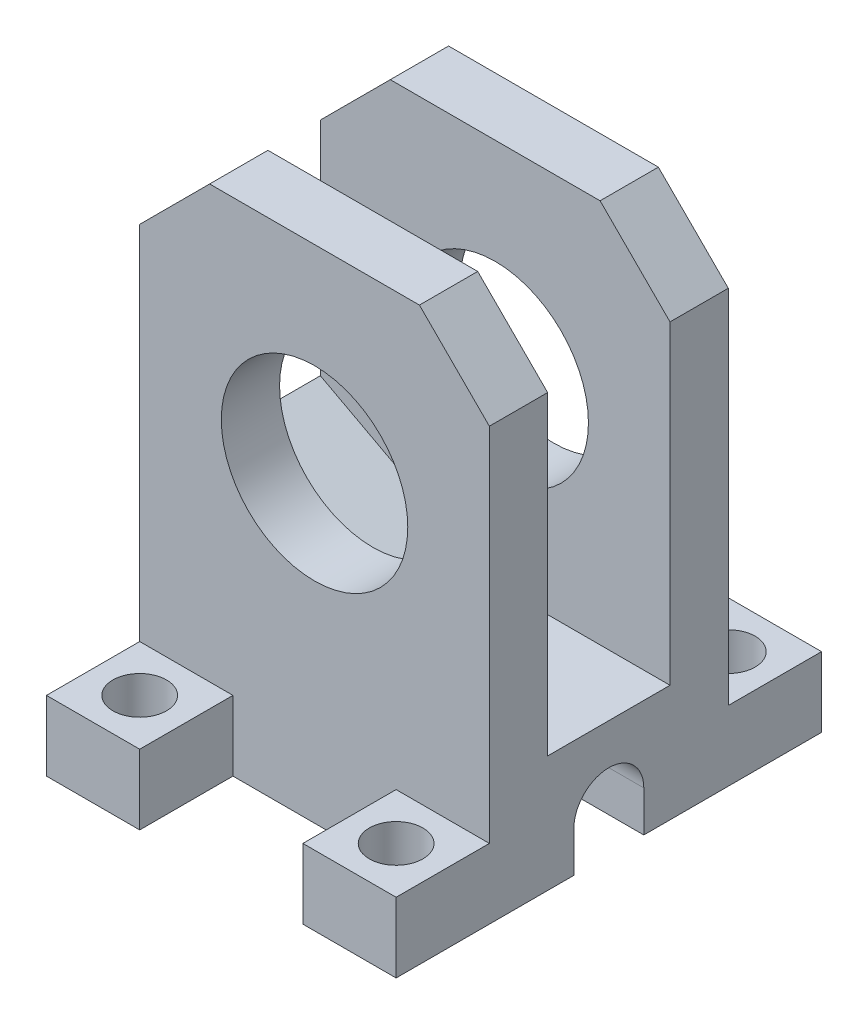
ISO-10303-21;
HEADER;
FILE_DESCRIPTION(('STEP AP214'),'2;1');
FILE_NAME('part.step','',(''),(''),'','','');
FILE_SCHEMA(('AUTOMOTIVE_DESIGN { 1 0 10303 214 1 1 1 1 }'));
ENDSEC;
DATA;
#1=APPLICATION_CONTEXT('core data for automotive mechanical design processes');
#2=APPLICATION_PROTOCOL_DEFINITION('international standard','automotive_design',2000,#1);
#3=PRODUCT_CONTEXT('',#1,'mechanical');
#4=PRODUCT('Part','Part','',(#3));
#5=PRODUCT_RELATED_PRODUCT_CATEGORY('part','',(#4));
#6=PRODUCT_DEFINITION_FORMATION('','',#4);
#7=PRODUCT_DEFINITION_CONTEXT('part definition',#1,'design');
#8=PRODUCT_DEFINITION('design','',#6,#7);
#9=PRODUCT_DEFINITION_SHAPE('','',#8);
#10=(LENGTH_UNIT() NAMED_UNIT(*) SI_UNIT(.MILLI.,.METRE.));
#11=(NAMED_UNIT(*) PLANE_ANGLE_UNIT() SI_UNIT($,.RADIAN.));
#12=(NAMED_UNIT(*) SI_UNIT($,.STERADIAN.) SOLID_ANGLE_UNIT());
#13=UNCERTAINTY_MEASURE_WITH_UNIT(LENGTH_MEASURE(1.E-05),#10,'distance_accuracy_value','');
#14=(GEOMETRIC_REPRESENTATION_CONTEXT(3) GLOBAL_UNCERTAINTY_ASSIGNED_CONTEXT((#13)) GLOBAL_UNIT_ASSIGNED_CONTEXT((#10,
#11,#12)) REPRESENTATION_CONTEXT('',''));
#15=CARTESIAN_POINT('',(0.,0.,0.));
#16=DIRECTION('',(0.,0.,1.));
#17=DIRECTION('',(1.,0.,0.));
#18=AXIS2_PLACEMENT_3D('',#15,#16,#17);
#19=CARTESIAN_POINT('',(0.,0.,-5.));
#20=DIRECTION('',(0.,0.,-1.));
#21=DIRECTION('',(-1.,0.,0.));
#22=AXIS2_PLACEMENT_3D('',#19,#20,#21);
#23=PLANE('',#22);
#24=CARTESIAN_POINT('',(0.,28.,-5.));
#25=DIRECTION('',(0.,0.,1.));
#26=DIRECTION('',(1.,0.,0.));
#27=AXIS2_PLACEMENT_3D('',#24,#25,#26);
#28=CIRCLE('',#27,8.);
#29=CARTESIAN_POINT('',(8.,28.,-5.));
#30=VERTEX_POINT('',#29);
#31=EDGE_CURVE('E260',#30,#30,#28,.T.);
#32=ORIENTED_EDGE('',*,*,#31,.T.);
#33=EDGE_LOOP('',(#32));
#34=FACE_BOUND('',#33,.T.);
#35=DIRECTION('',(1.,0.,0.));
#36=VECTOR('',#35,1.);
#37=CARTESIAN_POINT('',(-15.,12.,-5.));
#38=LINE('',#37,#36);
#39=CARTESIAN_POINT('',(0.,12.,-5.));
#40=VERTEX_POINT('',#39);
#41=CARTESIAN_POINT('',(15.,12.,-5.));
#42=VERTEX_POINT('',#41);
#43=EDGE_CURVE('E304',#40,#42,#38,.T.);
#44=ORIENTED_EDGE('',*,*,#43,.F.);
#45=DIRECTION('',(0.882352941176471,-0.470588235294118,0.));
#46=VECTOR('',#45,1.);
#47=CARTESIAN_POINT('',(-15.,20.,-5.));
#48=LINE('',#47,#46);
#49=CARTESIAN_POINT('',(-15.,20.,-5.));
#50=VERTEX_POINT('',#49);
#51=EDGE_CURVE('E52',#50,#40,#48,.T.);
#52=ORIENTED_EDGE('',*,*,#51,.F.);
#53=DIRECTION('',(0.,-1.,0.));
#54=VECTOR('',#53,1.);
#55=CARTESIAN_POINT('',(-15.,0.,-5.));
#56=LINE('',#55,#54);
#57=CARTESIAN_POINT('',(-15.,39.,-5.));
#58=VERTEX_POINT('',#57);
#59=EDGE_CURVE('E272',#58,#50,#56,.T.);
#60=ORIENTED_EDGE('',*,*,#59,.F.);
#61=DIRECTION('',(0.707106781186548,0.707106781186547,0.));
#62=VECTOR('',#61,1.);
#63=CARTESIAN_POINT('',(-27.,27.,-5.));
#64=LINE('',#63,#62);
#65=CARTESIAN_POINT('',(-9.,45.,-5.));
#66=VERTEX_POINT('',#65);
#67=EDGE_CURVE('E355',#58,#66,#64,.T.);
#68=ORIENTED_EDGE('',*,*,#67,.T.);
#69=DIRECTION('',(-1.,0.,0.));
#70=VECTOR('',#69,1.);
#71=CARTESIAN_POINT('',(-15.,45.,-5.));
#72=LINE('',#71,#70);
#73=CARTESIAN_POINT('',(8.99999999999999,45.,-5.));
#74=VERTEX_POINT('',#73);
#75=EDGE_CURVE('E249',#74,#66,#72,.T.);
#76=ORIENTED_EDGE('',*,*,#75,.F.);
#77=DIRECTION('',(0.707106781186548,-0.707106781186547,0.));
#78=VECTOR('',#77,1.);
#79=CARTESIAN_POINT('',(27.,27.,-5.));
#80=LINE('',#79,#78);
#81=CARTESIAN_POINT('',(15.,39.,-5.));
#82=VERTEX_POINT('',#81);
#83=EDGE_CURVE('E349',#74,#82,#80,.T.);
#84=ORIENTED_EDGE('',*,*,#83,.T.);
#85=DIRECTION('',(0.,1.,0.));
#86=VECTOR('',#85,1.);
#87=CARTESIAN_POINT('',(15.,45.,-5.));
#88=LINE('',#87,#86);
#89=EDGE_CURVE('E258',#42,#82,#88,.T.);
#90=ORIENTED_EDGE('',*,*,#89,.F.);
#91=EDGE_LOOP('',(#44,#52,#60,#68,#76,#84,#90));
#92=FACE_BOUND('',#91,.T.);
#93=ADVANCED_FACE('F37',(#34,#92),#23,.T.);
#94=CARTESIAN_POINT('',(-15.,45.,-15.5));
#95=DIRECTION('',(0.,0.,1.));
#96=DIRECTION('',(1.,0.,0.));
#97=AXIS2_PLACEMENT_3D('',#94,#95,#96);
#98=PLANE('',#97);
#99=CARTESIAN_POINT('',(0.,28.,-15.5));
#100=DIRECTION('',(0.,0.,1.));
#101=DIRECTION('',(1.,0.,0.));
#102=AXIS2_PLACEMENT_3D('',#99,#100,#101);
#103=CIRCLE('',#102,8.);
#104=CARTESIAN_POINT('',(8.,28.,-15.5));
#105=VERTEX_POINT('',#104);
#106=EDGE_CURVE('E294',#105,#105,#103,.T.);
#107=ORIENTED_EDGE('',*,*,#106,.F.);
#108=EDGE_LOOP('',(#107));
#109=FACE_BOUND('',#108,.T.);
#110=DIRECTION('',(0.,-1.,0.));
#111=VECTOR('',#110,1.);
#112=CARTESIAN_POINT('',(-15.,45.,-15.5));
#113=LINE('',#112,#111);
#114=CARTESIAN_POINT('',(-15.,39.,-15.5));
#115=VERTEX_POINT('',#114);
#116=CARTESIAN_POINT('',(-15.,20.,-15.5));
#117=VERTEX_POINT('',#116);
#118=EDGE_CURVE('E60',#115,#117,#113,.T.);
#119=ORIENTED_EDGE('',*,*,#118,.T.);
#120=DIRECTION('',(0.882352941176471,-0.470588235294118,0.));
#121=VECTOR('',#120,1.);
#122=CARTESIAN_POINT('',(-15.,20.,-15.5));
#123=LINE('',#122,#121);
#124=CARTESIAN_POINT('',(0.,12.,-15.5));
#125=VERTEX_POINT('',#124);
#126=EDGE_CURVE('E332',#117,#125,#123,.T.);
#127=ORIENTED_EDGE('',*,*,#126,.T.);
#128=DIRECTION('',(1.,0.,0.));
#129=VECTOR('',#128,1.);
#130=CARTESIAN_POINT('',(-15.,12.,-15.5));
#131=LINE('',#130,#129);
#132=CARTESIAN_POINT('',(15.,12.,-15.5));
#133=VERTEX_POINT('',#132);
#134=EDGE_CURVE('E311',#125,#133,#131,.T.);
#135=ORIENTED_EDGE('',*,*,#134,.T.);
#136=DIRECTION('',(0.,-1.,0.));
#137=VECTOR('',#136,1.);
#138=CARTESIAN_POINT('',(15.,45.,-15.5));
#139=LINE('',#138,#137);
#140=CARTESIAN_POINT('',(15.,39.,-15.5));
#141=VERTEX_POINT('',#140);
#142=EDGE_CURVE('E305',#141,#133,#139,.T.);
#143=ORIENTED_EDGE('',*,*,#142,.F.);
#144=DIRECTION('',(-0.707106781186548,0.707106781186547,0.));
#145=VECTOR('',#144,1.);
#146=CARTESIAN_POINT('',(-3.00000000000001,57.,-15.5));
#147=LINE('',#146,#145);
#148=CARTESIAN_POINT('',(8.99999999999999,45.,-15.5));
#149=VERTEX_POINT('',#148);
#150=EDGE_CURVE('E347',#141,#149,#147,.T.);
#151=ORIENTED_EDGE('',*,*,#150,.T.);
#152=DIRECTION('',(-1.,0.,0.));
#153=VECTOR('',#152,1.);
#154=CARTESIAN_POINT('',(-15.,45.,-15.5));
#155=LINE('',#154,#153);
#156=CARTESIAN_POINT('',(-9.00000000000001,45.,-15.5));
#157=VERTEX_POINT('',#156);
#158=EDGE_CURVE('E283',#149,#157,#155,.T.);
#159=ORIENTED_EDGE('',*,*,#158,.T.);
#160=DIRECTION('',(-0.707106781186548,-0.707106781186547,0.));
#161=VECTOR('',#160,1.);
#162=CARTESIAN_POINT('',(-12.,42.,-15.5));
#163=LINE('',#162,#161);
#164=EDGE_CURVE('E353',#157,#115,#163,.T.);
#165=ORIENTED_EDGE('',*,*,#164,.T.);
#166=EDGE_LOOP('',(#119,#127,#135,#143,#151,#159,#165));
#167=FACE_BOUND('',#166,.T.);
#168=ADVANCED_FACE('F519',(#109,#167),#98,.T.);
#169=CARTESIAN_POINT('',(-15.,12.,-15.5));
#170=DIRECTION('',(0.,-1.,0.));
#171=DIRECTION('',(1.,0.,0.));
#172=AXIS2_PLACEMENT_3D('',#169,#170,#171);
#173=PLANE('',#172);
#174=DIRECTION('',(0.,0.,1.));
#175=VECTOR('',#174,1.);
#176=CARTESIAN_POINT('',(0.,12.,-15.5));
#177=LINE('',#176,#175);
#178=EDGE_CURVE('E333',#125,#40,#177,.T.);
#179=ORIENTED_EDGE('',*,*,#178,.T.);
#180=ORIENTED_EDGE('',*,*,#43,.T.);
#181=DIRECTION('',(0.,0.,1.));
#182=VECTOR('',#181,1.);
#183=CARTESIAN_POINT('',(15.,12.,-15.5));
#184=LINE('',#183,#182);
#185=EDGE_CURVE('E313',#133,#42,#184,.T.);
#186=ORIENTED_EDGE('',*,*,#185,.F.);
#187=ORIENTED_EDGE('',*,*,#134,.F.);
#188=EDGE_LOOP('',(#179,#180,#186,#187));
#189=FACE_BOUND('',#188,.T.);
#190=ADVANCED_FACE('F525',(#189),#173,.F.);
#191=CARTESIAN_POINT('',(-15.,0.,-5.));
#192=DIRECTION('',(-1.,0.,0.));
#193=DIRECTION('',(0.,0.,1.));
#194=AXIS2_PLACEMENT_3D('',#191,#192,#193);
#195=PLANE('',#194);
#196=ORIENTED_EDGE('',*,*,#59,.T.);
#197=DIRECTION('',(0.,0.,1.));
#198=VECTOR('',#197,1.);
#199=CARTESIAN_POINT('',(-15.,20.,-15.5));
#200=LINE('',#199,#198);
#201=EDGE_CURVE('E327',#117,#50,#200,.T.);
#202=ORIENTED_EDGE('',*,*,#201,.F.);
#203=ORIENTED_EDGE('',*,*,#118,.F.);
#204=DIRECTION('',(0.,0.,1.));
#205=VECTOR('',#204,1.);
#206=CARTESIAN_POINT('',(-15.,39.,-50.));
#207=LINE('',#206,#205);
#208=CARTESIAN_POINT('',(-15.,39.,-20.5));
#209=VERTEX_POINT('',#208);
#210=EDGE_CURVE('E339',#209,#115,#207,.T.);
#211=ORIENTED_EDGE('',*,*,#210,.F.);
#212=DIRECTION('',(0.,-1.,0.));
#213=VECTOR('',#212,1.);
#214=CARTESIAN_POINT('',(-15.,45.,-20.5));
#215=LINE('',#214,#213);
#216=CARTESIAN_POINT('',(-15.,8.00000000000001,-20.5));
#217=VERTEX_POINT('',#216);
#218=EDGE_CURVE('E296',#209,#217,#215,.T.);
#219=ORIENTED_EDGE('',*,*,#218,.T.);
#220=DIRECTION('',(0.,0.,-1.));
#221=VECTOR('',#220,1.);
#222=CARTESIAN_POINT('',(-15.,8.,-20.5));
#223=LINE('',#222,#221);
#224=CARTESIAN_POINT('',(-15.,8.,-28.5));
#225=VERTEX_POINT('',#224);
#226=EDGE_CURVE('E439',#217,#225,#223,.T.);
#227=ORIENTED_EDGE('',*,*,#226,.T.);
#228=DIRECTION('',(0.,-1.,0.));
#229=VECTOR('',#228,1.);
#230=CARTESIAN_POINT('',(-15.,8.,-28.5));
#231=LINE('',#230,#229);
#232=CARTESIAN_POINT('',(-15.,2.,-28.5));
#233=VERTEX_POINT('',#232);
#234=EDGE_CURVE('E448',#225,#233,#231,.T.);
#235=ORIENTED_EDGE('',*,*,#234,.T.);
#236=DIRECTION('',(0.,0.,-1.));
#237=VECTOR('',#236,1.);
#238=CARTESIAN_POINT('',(-15.,2.,8.));
#239=LINE('',#238,#237);
#240=CARTESIAN_POINT('',(-15.,2.,-13.25));
#241=VERTEX_POINT('',#240);
#242=EDGE_CURVE('E376',#241,#233,#239,.T.);
#243=ORIENTED_EDGE('',*,*,#242,.F.);
#244=DIRECTION('',(0.,-1.,0.));
#245=VECTOR('',#244,1.);
#246=CARTESIAN_POINT('',(-15.,0.,-13.25));
#247=LINE('',#246,#245);
#248=CARTESIAN_POINT('',(-15.,5.5,-13.25));
#249=VERTEX_POINT('',#248);
#250=EDGE_CURVE('E361',#249,#241,#247,.T.);
#251=ORIENTED_EDGE('',*,*,#250,.F.);
#252=CARTESIAN_POINT('',(-15.,5.5,-10.25));
#253=DIRECTION('',(-1.,0.,0.));
#254=DIRECTION('',(0.,0.,1.));
#255=AXIS2_PLACEMENT_3D('',#252,#253,#254);
#256=CIRCLE('',#255,3.);
#257=CARTESIAN_POINT('',(-15.,5.5,-7.25));
#258=VERTEX_POINT('',#257);
#259=EDGE_CURVE('E358',#258,#249,#256,.T.);
#260=ORIENTED_EDGE('',*,*,#259,.F.);
#261=DIRECTION('',(0.,1.,0.));
#262=VECTOR('',#261,1.);
#263=CARTESIAN_POINT('',(-15.,0.,-7.25));
#264=LINE('',#263,#262);
#265=CARTESIAN_POINT('',(-15.,2.,-7.25));
#266=VERTEX_POINT('',#265);
#267=EDGE_CURVE('E363',#266,#258,#264,.T.);
#268=ORIENTED_EDGE('',*,*,#267,.F.);
#269=CARTESIAN_POINT('',(-15.,2.,8.));
#270=VERTEX_POINT('',#269);
#271=EDGE_CURVE('E377',#270,#266,#239,.T.);
#272=ORIENTED_EDGE('',*,*,#271,.F.);
#273=DIRECTION('',(0.,-1.,0.));
#274=VECTOR('',#273,1.);
#275=CARTESIAN_POINT('',(-15.,8.,8.));
#276=LINE('',#275,#274);
#277=CARTESIAN_POINT('',(-15.,8.,8.));
#278=VERTEX_POINT('',#277);
#279=EDGE_CURVE('E496',#278,#270,#276,.T.);
#280=ORIENTED_EDGE('',*,*,#279,.F.);
#281=DIRECTION('',(0.,0.,-1.));
#282=VECTOR('',#281,1.);
#283=CARTESIAN_POINT('',(-15.,8.,0.));
#284=LINE('',#283,#282);
#285=CARTESIAN_POINT('',(-15.,8.,0.));
#286=VERTEX_POINT('',#285);
#287=EDGE_CURVE('E492',#278,#286,#284,.T.);
#288=ORIENTED_EDGE('',*,*,#287,.T.);
#289=DIRECTION('',(0.,-1.,0.));
#290=VECTOR('',#289,1.);
#291=CARTESIAN_POINT('',(-15.,0.,0.));
#292=LINE('',#291,#290);
#293=CARTESIAN_POINT('',(-15.,39.,0.));
#294=VERTEX_POINT('',#293);
#295=EDGE_CURVE('E255',#294,#286,#292,.T.);
#296=ORIENTED_EDGE('',*,*,#295,.F.);
#297=EDGE_CURVE('E236',#58,#294,#207,.T.);
#298=ORIENTED_EDGE('',*,*,#297,.F.);
#299=EDGE_LOOP('',(#196,#202,#203,#211,#219,#227,#235,#243,#251,#260,#268,#272,#280,#288,#296,#298));
#300=FACE_BOUND('',#299,.T.);
#301=ADVANCED_FACE('F326',(#300),#195,.T.);
#302=CARTESIAN_POINT('',(15.,45.,-5.));
#303=DIRECTION('',(1.,0.,0.));
#304=DIRECTION('',(0.,1.,0.));
#305=AXIS2_PLACEMENT_3D('',#302,#303,#304);
#306=PLANE('',#305);
#307=DIRECTION('',(0.,-1.,0.));
#308=VECTOR('',#307,1.);
#309=CARTESIAN_POINT('',(15.,45.,-20.5));
#310=LINE('',#309,#308);
#311=CARTESIAN_POINT('',(15.,39.,-20.5));
#312=VERTEX_POINT('',#311);
#313=CARTESIAN_POINT('',(15.,8.,-20.5));
#314=VERTEX_POINT('',#313);
#315=EDGE_CURVE('E308',#312,#314,#310,.T.);
#316=ORIENTED_EDGE('',*,*,#315,.F.);
#317=DIRECTION('',(0.,0.,1.));
#318=VECTOR('',#317,1.);
#319=CARTESIAN_POINT('',(15.,39.,-50.));
#320=LINE('',#319,#318);
#321=EDGE_CURVE('E344',#312,#141,#320,.T.);
#322=ORIENTED_EDGE('',*,*,#321,.T.);
#323=ORIENTED_EDGE('',*,*,#142,.T.);
#324=ORIENTED_EDGE('',*,*,#185,.T.);
#325=ORIENTED_EDGE('',*,*,#89,.T.);
#326=CARTESIAN_POINT('',(15.,39.,0.));
#327=VERTEX_POINT('',#326);
#328=EDGE_CURVE('E342',#82,#327,#320,.T.);
#329=ORIENTED_EDGE('',*,*,#328,.T.);
#330=DIRECTION('',(0.,1.,0.));
#331=VECTOR('',#330,1.);
#332=CARTESIAN_POINT('',(15.,45.,0.));
#333=LINE('',#332,#331);
#334=CARTESIAN_POINT('',(15.,8.00000000000001,0.));
#335=VERTEX_POINT('',#334);
#336=EDGE_CURVE('E256',#335,#327,#333,.T.);
#337=ORIENTED_EDGE('',*,*,#336,.F.);
#338=DIRECTION('',(0.,0.,1.));
#339=VECTOR('',#338,1.);
#340=CARTESIAN_POINT('',(15.,8.,0.));
#341=LINE('',#340,#339);
#342=CARTESIAN_POINT('',(15.,8.,8.));
#343=VERTEX_POINT('',#342);
#344=EDGE_CURVE('E462',#335,#343,#341,.T.);
#345=ORIENTED_EDGE('',*,*,#344,.T.);
#346=DIRECTION('',(0.,-1.,0.));
#347=VECTOR('',#346,1.);
#348=CARTESIAN_POINT('',(15.,8.,8.));
#349=LINE('',#348,#347);
#350=CARTESIAN_POINT('',(15.,2.,8.));
#351=VERTEX_POINT('',#350);
#352=EDGE_CURVE('E471',#343,#351,#349,.T.);
#353=ORIENTED_EDGE('',*,*,#352,.T.);
#354=DIRECTION('',(0.,0.,1.));
#355=VECTOR('',#354,1.);
#356=CARTESIAN_POINT('',(15.,2.,-28.5));
#357=LINE('',#356,#355);
#358=CARTESIAN_POINT('',(15.,2.,-7.25));
#359=VERTEX_POINT('',#358);
#360=EDGE_CURVE('E390',#359,#351,#357,.T.);
#361=ORIENTED_EDGE('',*,*,#360,.F.);
#362=DIRECTION('',(0.,-1.,0.));
#363=VECTOR('',#362,1.);
#364=CARTESIAN_POINT('',(15.,45.,-7.24999999999999));
#365=LINE('',#364,#363);
#366=CARTESIAN_POINT('',(15.,5.5,-7.25));
#367=VERTEX_POINT('',#366);
#368=EDGE_CURVE('E372',#367,#359,#365,.T.);
#369=ORIENTED_EDGE('',*,*,#368,.F.);
#370=CARTESIAN_POINT('',(15.,5.5,-10.25));
#371=DIRECTION('',(1.,0.,0.));
#372=DIRECTION('',(0.,1.,0.));
#373=AXIS2_PLACEMENT_3D('',#370,#371,#372);
#374=CIRCLE('',#373,3.);
#375=CARTESIAN_POINT('',(15.,5.5,-13.25));
#376=VERTEX_POINT('',#375);
#377=EDGE_CURVE('E274',#376,#367,#374,.T.);
#378=ORIENTED_EDGE('',*,*,#377,.F.);
#379=DIRECTION('',(0.,1.,0.));
#380=VECTOR('',#379,1.);
#381=CARTESIAN_POINT('',(15.,45.,-13.25));
#382=LINE('',#381,#380);
#383=CARTESIAN_POINT('',(15.,2.,-13.25));
#384=VERTEX_POINT('',#383);
#385=EDGE_CURVE('E369',#384,#376,#382,.T.);
#386=ORIENTED_EDGE('',*,*,#385,.F.);
#387=CARTESIAN_POINT('',(15.,2.,-28.5));
#388=VERTEX_POINT('',#387);
#389=EDGE_CURVE('E391',#388,#384,#357,.T.);
#390=ORIENTED_EDGE('',*,*,#389,.F.);
#391=DIRECTION('',(0.,-1.,0.));
#392=VECTOR('',#391,1.);
#393=CARTESIAN_POINT('',(15.,8.,-28.5));
#394=LINE('',#393,#392);
#395=CARTESIAN_POINT('',(15.,8.,-28.5));
#396=VERTEX_POINT('',#395);
#397=EDGE_CURVE('E425',#396,#388,#394,.T.);
#398=ORIENTED_EDGE('',*,*,#397,.F.);
#399=DIRECTION('',(0.,0.,1.));
#400=VECTOR('',#399,1.);
#401=CARTESIAN_POINT('',(15.,8.,-20.5));
#402=LINE('',#401,#400);
#403=EDGE_CURVE('E421',#396,#314,#402,.T.);
#404=ORIENTED_EDGE('',*,*,#403,.T.);
#405=EDGE_LOOP('',(#316,#322,#323,#324,#325,#329,#337,#345,#353,#361,#369,#378,#386,#390,#398,#404));
#406=FACE_BOUND('',#405,.T.);
#407=ADVANCED_FACE('F39',(#406),#306,.T.);
#408=CARTESIAN_POINT('',(0.,0.,0.));
#409=DIRECTION('',(0.,0.,-1.));
#410=DIRECTION('',(-1.,0.,0.));
#411=AXIS2_PLACEMENT_3D('',#408,#409,#410);
#412=PLANE('',#411);
#413=CARTESIAN_POINT('',(0.,28.,0.));
#414=DIRECTION('',(0.,0.,1.));
#415=DIRECTION('',(1.,0.,0.));
#416=AXIS2_PLACEMENT_3D('',#413,#414,#415);
#417=CIRCLE('',#416,8.);
#418=CARTESIAN_POINT('',(8.,28.,0.));
#419=VERTEX_POINT('',#418);
#420=EDGE_CURVE('E317',#419,#419,#417,.T.);
#421=ORIENTED_EDGE('',*,*,#420,.F.);
#422=EDGE_LOOP('',(#421));
#423=FACE_BOUND('',#422,.T.);
#424=DIRECTION('',(-0.707106781186548,-0.707106781186547,0.));
#425=VECTOR('',#424,1.);
#426=CARTESIAN_POINT('',(-27.,27.,0.));
#427=LINE('',#426,#425);
#428=CARTESIAN_POINT('',(-9.,45.,0.));
#429=VERTEX_POINT('',#428);
#430=EDGE_CURVE('E230',#429,#294,#427,.T.);
#431=ORIENTED_EDGE('',*,*,#430,.T.);
#432=ORIENTED_EDGE('',*,*,#295,.T.);
#433=DIRECTION('',(1.,0.,0.));
#434=VECTOR('',#433,1.);
#435=CARTESIAN_POINT('',(-15.,8.,0.));
#436=LINE('',#435,#434);
#437=CARTESIAN_POINT('',(-7.,8.,0.));
#438=VERTEX_POINT('',#437);
#439=EDGE_CURVE('E483',#286,#438,#436,.T.);
#440=ORIENTED_EDGE('',*,*,#439,.T.);
#441=DIRECTION('',(0.,-1.,0.));
#442=VECTOR('',#441,1.);
#443=CARTESIAN_POINT('',(-7.,8.,0.));
#444=LINE('',#443,#442);
#445=CARTESIAN_POINT('',(-7.,2.,0.));
#446=VERTEX_POINT('',#445);
#447=EDGE_CURVE('E495',#438,#446,#444,.T.);
#448=ORIENTED_EDGE('',*,*,#447,.T.);
#449=DIRECTION('',(-1.,0.,0.));
#450=VECTOR('',#449,1.);
#451=CARTESIAN_POINT('',(7.,2.,0.));
#452=LINE('',#451,#450);
#453=CARTESIAN_POINT('',(7.,2.,0.));
#454=VERTEX_POINT('',#453);
#455=EDGE_CURVE('E398',#454,#446,#452,.T.);
#456=ORIENTED_EDGE('',*,*,#455,.F.);
#457=DIRECTION('',(0.,-1.,0.));
#458=VECTOR('',#457,1.);
#459=CARTESIAN_POINT('',(7.,8.,0.));
#460=LINE('',#459,#458);
#461=CARTESIAN_POINT('',(7.,8.,0.));
#462=VERTEX_POINT('',#461);
#463=EDGE_CURVE('E472',#462,#454,#460,.T.);
#464=ORIENTED_EDGE('',*,*,#463,.F.);
#465=DIRECTION('',(1.,0.,0.));
#466=VECTOR('',#465,1.);
#467=CARTESIAN_POINT('',(7.,8.,0.));
#468=LINE('',#467,#466);
#469=EDGE_CURVE('E460',#462,#335,#468,.T.);
#470=ORIENTED_EDGE('',*,*,#469,.T.);
#471=ORIENTED_EDGE('',*,*,#336,.T.);
#472=DIRECTION('',(-0.707106781186548,0.707106781186547,0.));
#473=VECTOR('',#472,1.);
#474=CARTESIAN_POINT('',(27.,27.,0.));
#475=LINE('',#474,#473);
#476=CARTESIAN_POINT('',(8.99999999999999,45.,0.));
#477=VERTEX_POINT('',#476);
#478=EDGE_CURVE('E254',#327,#477,#475,.T.);
#479=ORIENTED_EDGE('',*,*,#478,.T.);
#480=DIRECTION('',(-1.,0.,0.));
#481=VECTOR('',#480,1.);
#482=CARTESIAN_POINT('',(-15.,45.,0.));
#483=LINE('',#482,#481);
#484=EDGE_CURVE('E247',#477,#429,#483,.T.);
#485=ORIENTED_EDGE('',*,*,#484,.T.);
#486=EDGE_LOOP('',(#431,#432,#440,#448,#456,#464,#470,#471,#479,#485));
#487=FACE_BOUND('',#486,.T.);
#488=ADVANCED_FACE('F252',(#423,#487),#412,.F.);
#489=CARTESIAN_POINT('',(15.,45.,-20.5));
#490=DIRECTION('',(0.,0.,-1.));
#491=DIRECTION('',(-1.,0.,0.));
#492=AXIS2_PLACEMENT_3D('',#489,#490,#491);
#493=PLANE('',#492);
#494=CARTESIAN_POINT('',(0.,28.,-20.5));
#495=DIRECTION('',(0.,0.,-1.));
#496=DIRECTION('',(-1.,0.,0.));
#497=AXIS2_PLACEMENT_3D('',#494,#495,#496);
#498=CIRCLE('',#497,8.);
#499=CARTESIAN_POINT('',(-8.,28.,-20.5));
#500=VERTEX_POINT('',#499);
#501=EDGE_CURVE('E299',#500,#500,#498,.T.);
#502=ORIENTED_EDGE('',*,*,#501,.F.);
#503=EDGE_LOOP('',(#502));
#504=FACE_BOUND('',#503,.T.);
#505=ORIENTED_EDGE('',*,*,#218,.F.);
#506=DIRECTION('',(0.707106781186548,0.707106781186547,0.));
#507=VECTOR('',#506,1.);
#508=CARTESIAN_POINT('',(3.,57.,-20.5));
#509=LINE('',#508,#507);
#510=CARTESIAN_POINT('',(-9.,45.,-20.5));
#511=VERTEX_POINT('',#510);
#512=EDGE_CURVE('E293',#209,#511,#509,.T.);
#513=ORIENTED_EDGE('',*,*,#512,.T.);
#514=DIRECTION('',(1.,0.,0.));
#515=VECTOR('',#514,1.);
#516=CARTESIAN_POINT('',(15.,45.,-20.5));
#517=LINE('',#516,#515);
#518=CARTESIAN_POINT('',(8.99999999999999,45.,-20.5));
#519=VERTEX_POINT('',#518);
#520=EDGE_CURVE('E281',#511,#519,#517,.T.);
#521=ORIENTED_EDGE('',*,*,#520,.T.);
#522=DIRECTION('',(0.707106781186548,-0.707106781186547,0.));
#523=VECTOR('',#522,1.);
#524=CARTESIAN_POINT('',(12.,42.,-20.5));
#525=LINE('',#524,#523);
#526=EDGE_CURVE('E291',#519,#312,#525,.T.);
#527=ORIENTED_EDGE('',*,*,#526,.T.);
#528=ORIENTED_EDGE('',*,*,#315,.T.);
#529=DIRECTION('',(-1.,0.,0.));
#530=VECTOR('',#529,1.);
#531=CARTESIAN_POINT('',(7.,8.,-20.5));
#532=LINE('',#531,#530);
#533=CARTESIAN_POINT('',(7.,8.,-20.5));
#534=VERTEX_POINT('',#533);
#535=EDGE_CURVE('E412',#314,#534,#532,.T.);
#536=ORIENTED_EDGE('',*,*,#535,.T.);
#537=DIRECTION('',(0.,-1.,0.));
#538=VECTOR('',#537,1.);
#539=CARTESIAN_POINT('',(7.,8.,-20.5));
#540=LINE('',#539,#538);
#541=CARTESIAN_POINT('',(7.,2.,-20.5));
#542=VERTEX_POINT('',#541);
#543=EDGE_CURVE('E424',#534,#542,#540,.T.);
#544=ORIENTED_EDGE('',*,*,#543,.T.);
#545=DIRECTION('',(1.,0.,0.));
#546=VECTOR('',#545,1.);
#547=CARTESIAN_POINT('',(-7.,2.,-20.5));
#548=LINE('',#547,#546);
#549=CARTESIAN_POINT('',(-7.,2.,-20.5));
#550=VERTEX_POINT('',#549);
#551=EDGE_CURVE('E384',#550,#542,#548,.T.);
#552=ORIENTED_EDGE('',*,*,#551,.F.);
#553=DIRECTION('',(0.,-1.,0.));
#554=VECTOR('',#553,1.);
#555=CARTESIAN_POINT('',(-7.,8.,-20.5));
#556=LINE('',#555,#554);
#557=CARTESIAN_POINT('',(-7.,8.,-20.5));
#558=VERTEX_POINT('',#557);
#559=EDGE_CURVE('E449',#558,#550,#556,.T.);
#560=ORIENTED_EDGE('',*,*,#559,.F.);
#561=DIRECTION('',(-1.,0.,0.));
#562=VECTOR('',#561,1.);
#563=CARTESIAN_POINT('',(-7.,8.,-20.5));
#564=LINE('',#563,#562);
#565=EDGE_CURVE('E436',#558,#217,#564,.T.);
#566=ORIENTED_EDGE('',*,*,#565,.T.);
#567=EDGE_LOOP('',(#505,#513,#521,#527,#528,#536,#544,#552,#560,#566));
#568=FACE_BOUND('',#567,.T.);
#569=ADVANCED_FACE('F290',(#504,#568),#493,.T.);
#570=CARTESIAN_POINT('',(-15.,45.,-5.));
#571=DIRECTION('',(0.,1.,0.));
#572=DIRECTION('',(0.,0.,1.));
#573=AXIS2_PLACEMENT_3D('',#570,#571,#572);
#574=PLANE('',#573);
#575=ORIENTED_EDGE('',*,*,#75,.T.);
#576=DIRECTION('',(0.,0.,1.));
#577=VECTOR('',#576,1.);
#578=CARTESIAN_POINT('',(-9.,45.,-50.));
#579=LINE('',#578,#577);
#580=EDGE_CURVE('E233',#66,#429,#579,.T.);
#581=ORIENTED_EDGE('',*,*,#580,.T.);
#582=ORIENTED_EDGE('',*,*,#484,.F.);
#583=DIRECTION('',(0.,0.,1.));
#584=VECTOR('',#583,1.);
#585=CARTESIAN_POINT('',(8.99999999999999,45.,-50.));
#586=LINE('',#585,#584);
#587=EDGE_CURVE('E240',#74,#477,#586,.T.);
#588=ORIENTED_EDGE('',*,*,#587,.F.);
#589=EDGE_LOOP('',(#575,#581,#582,#588));
#590=FACE_BOUND('',#589,.T.);
#591=ADVANCED_FACE('F245',(#590),#574,.T.);
#592=CARTESIAN_POINT('',(0.,45.,0.));
#593=DIRECTION('',(0.,1.,0.));
#594=DIRECTION('',(0.,0.,1.));
#595=AXIS2_PLACEMENT_3D('',#592,#593,#594);
#596=PLANE('',#595);
#597=ORIENTED_EDGE('',*,*,#520,.F.);
#598=DIRECTION('',(0.,0.,1.));
#599=VECTOR('',#598,1.);
#600=CARTESIAN_POINT('',(-9.00000000000001,45.,0.));
#601=LINE('',#600,#599);
#602=EDGE_CURVE('E11',#511,#157,#601,.T.);
#603=ORIENTED_EDGE('',*,*,#602,.T.);
#604=ORIENTED_EDGE('',*,*,#158,.F.);
#605=DIRECTION('',(0.,0.,-1.));
#606=VECTOR('',#605,1.);
#607=CARTESIAN_POINT('',(8.99999999999999,45.,0.));
#608=LINE('',#607,#606);
#609=EDGE_CURVE('E45',#149,#519,#608,.T.);
#610=ORIENTED_EDGE('',*,*,#609,.T.);
#611=EDGE_LOOP('',(#597,#603,#604,#610));
#612=FACE_BOUND('',#611,.T.);
#613=ADVANCED_FACE('F280',(#612),#596,.T.);
#614=CARTESIAN_POINT('',(0.,2.,0.));
#615=DIRECTION('',(0.,-1.,0.));
#616=DIRECTION('',(0.,0.,-1.));
#617=AXIS2_PLACEMENT_3D('',#614,#615,#616);
#618=PLANE('',#617);
#619=DIRECTION('',(-1.,0.,0.));
#620=VECTOR('',#619,1.);
#621=CARTESIAN_POINT('',(0.,2.,-7.25));
#622=LINE('',#621,#620);
#623=EDGE_CURVE('E271',#359,#266,#622,.T.);
#624=ORIENTED_EDGE('',*,*,#623,.F.);
#625=ORIENTED_EDGE('',*,*,#360,.T.);
#626=DIRECTION('',(-1.,0.,0.));
#627=VECTOR('',#626,1.);
#628=CARTESIAN_POINT('',(15.,2.,8.));
#629=LINE('',#628,#627);
#630=CARTESIAN_POINT('',(7.,2.,8.));
#631=VERTEX_POINT('',#630);
#632=EDGE_CURVE('E394',#351,#631,#629,.T.);
#633=ORIENTED_EDGE('',*,*,#632,.T.);
#634=DIRECTION('',(0.,0.,-1.));
#635=VECTOR('',#634,1.);
#636=CARTESIAN_POINT('',(7.,2.,8.));
#637=LINE('',#636,#635);
#638=EDGE_CURVE('E396',#631,#454,#637,.T.);
#639=ORIENTED_EDGE('',*,*,#638,.T.);
#640=ORIENTED_EDGE('',*,*,#455,.T.);
#641=DIRECTION('',(0.,0.,1.));
#642=VECTOR('',#641,1.);
#643=CARTESIAN_POINT('',(-7.,2.,0.));
#644=LINE('',#643,#642);
#645=CARTESIAN_POINT('',(-7.,2.,8.));
#646=VERTEX_POINT('',#645);
#647=EDGE_CURVE('E268',#446,#646,#644,.T.);
#648=ORIENTED_EDGE('',*,*,#647,.T.);
#649=DIRECTION('',(-1.,0.,0.));
#650=VECTOR('',#649,1.);
#651=CARTESIAN_POINT('',(-7.,2.,8.));
#652=LINE('',#651,#650);
#653=EDGE_CURVE('E374',#646,#270,#652,.T.);
#654=ORIENTED_EDGE('',*,*,#653,.T.);
#655=ORIENTED_EDGE('',*,*,#271,.T.);
#656=EDGE_LOOP('',(#624,#625,#633,#639,#640,#648,#654,#655));
#657=FACE_BOUND('',#656,.T.);
#658=CARTESIAN_POINT('',(-11.,2.,4.));
#659=DIRECTION('',(0.,-1.,0.));
#660=DIRECTION('',(0.,0.,-1.));
#661=AXIS2_PLACEMENT_3D('',#658,#659,#660);
#662=CIRCLE('',#661,2.3);
#663=CARTESIAN_POINT('',(-11.,2.,1.7));
#664=VERTEX_POINT('',#663);
#665=EDGE_CURVE('E406',#664,#664,#662,.F.);
#666=ORIENTED_EDGE('',*,*,#665,.T.);
#667=EDGE_LOOP('',(#666));
#668=FACE_BOUND('',#667,.T.);
#669=CARTESIAN_POINT('',(11.,2.,4.));
#670=DIRECTION('',(0.,-1.,0.));
#671=DIRECTION('',(0.,0.,-1.));
#672=AXIS2_PLACEMENT_3D('',#669,#670,#671);
#673=CIRCLE('',#672,2.3);
#674=CARTESIAN_POINT('',(11.,2.,1.7));
#675=VERTEX_POINT('',#674);
#676=EDGE_CURVE('E403',#675,#675,#673,.F.);
#677=ORIENTED_EDGE('',*,*,#676,.T.);
#678=EDGE_LOOP('',(#677));
#679=FACE_BOUND('',#678,.T.);
#680=ADVANCED_FACE('F584',(#657,#668,#679),#618,.T.);
#681=CARTESIAN_POINT('',(-15.,8.,8.));
#682=DIRECTION('',(0.,0.,1.));
#683=DIRECTION('',(1.,0.,0.));
#684=AXIS2_PLACEMENT_3D('',#681,#682,#683);
#685=PLANE('',#684);
#686=ORIENTED_EDGE('',*,*,#279,.T.);
#687=ORIENTED_EDGE('',*,*,#653,.F.);
#688=DIRECTION('',(0.,-1.,0.));
#689=VECTOR('',#688,1.);
#690=CARTESIAN_POINT('',(-7.,8.,8.));
#691=LINE('',#690,#689);
#692=CARTESIAN_POINT('',(-7.,8.,8.));
#693=VERTEX_POINT('',#692);
#694=EDGE_CURVE('E499',#693,#646,#691,.T.);
#695=ORIENTED_EDGE('',*,*,#694,.F.);
#696=DIRECTION('',(-1.,0.,0.));
#697=VECTOR('',#696,1.);
#698=CARTESIAN_POINT('',(-15.,8.,8.));
#699=LINE('',#698,#697);
#700=EDGE_CURVE('E489',#693,#278,#699,.T.);
#701=ORIENTED_EDGE('',*,*,#700,.T.);
#702=EDGE_LOOP('',(#686,#687,#695,#701));
#703=FACE_BOUND('',#702,.T.);
#704=ADVANCED_FACE('F660',(#703),#685,.T.);
#705=CARTESIAN_POINT('',(-7.,8.,8.));
#706=DIRECTION('',(1.,0.,0.));
#707=DIRECTION('',(0.,0.,-1.));
#708=AXIS2_PLACEMENT_3D('',#705,#706,#707);
#709=PLANE('',#708);
#710=ORIENTED_EDGE('',*,*,#694,.T.);
#711=ORIENTED_EDGE('',*,*,#647,.F.);
#712=ORIENTED_EDGE('',*,*,#447,.F.);
#713=DIRECTION('',(0.,0.,1.));
#714=VECTOR('',#713,1.);
#715=CARTESIAN_POINT('',(-7.,8.,8.));
#716=LINE('',#715,#714);
#717=EDGE_CURVE('E486',#438,#693,#716,.T.);
#718=ORIENTED_EDGE('',*,*,#717,.T.);
#719=EDGE_LOOP('',(#710,#711,#712,#718));
#720=FACE_BOUND('',#719,.T.);
#721=ADVANCED_FACE('F655',(#720),#709,.T.);
#722=CARTESIAN_POINT('',(-11.,8.,4.));
#723=DIRECTION('',(0.,-1.,0.));
#724=DIRECTION('',(0.,0.,-1.));
#725=AXIS2_PLACEMENT_3D('',#722,#723,#724);
#726=CYLINDRICAL_SURFACE('',#725,2.3);
#727=CARTESIAN_POINT('',(-11.,8.,4.));
#728=DIRECTION('',(0.,-1.,0.));
#729=DIRECTION('',(0.,0.,-1.));
#730=AXIS2_PLACEMENT_3D('',#727,#728,#729);
#731=CIRCLE('',#730,2.3);
#732=CARTESIAN_POINT('',(-11.,8.,1.7));
#733=VERTEX_POINT('',#732);
#734=EDGE_CURVE('E475',#733,#733,#731,.T.);
#735=ORIENTED_EDGE('',*,*,#734,.F.);
#736=EDGE_LOOP('',(#735));
#737=FACE_BOUND('',#736,.T.);
#738=ORIENTED_EDGE('',*,*,#665,.F.);
#739=EDGE_LOOP('',(#738));
#740=FACE_BOUND('',#739,.T.);
#741=ADVANCED_FACE('F650',(#737,#740),#726,.F.);
#742=CARTESIAN_POINT('',(7.,8.,8.));
#743=DIRECTION('',(-1.,0.,0.));
#744=DIRECTION('',(0.,0.,1.));
#745=AXIS2_PLACEMENT_3D('',#742,#743,#744);
#746=PLANE('',#745);
#747=ORIENTED_EDGE('',*,*,#463,.T.);
#748=ORIENTED_EDGE('',*,*,#638,.F.);
#749=DIRECTION('',(0.,-1.,0.));
#750=VECTOR('',#749,1.);
#751=CARTESIAN_POINT('',(7.,8.,8.));
#752=LINE('',#751,#750);
#753=CARTESIAN_POINT('',(7.,8.,8.));
#754=VERTEX_POINT('',#753);
#755=EDGE_CURVE('E476',#754,#631,#752,.T.);
#756=ORIENTED_EDGE('',*,*,#755,.F.);
#757=DIRECTION('',(0.,0.,-1.));
#758=VECTOR('',#757,1.);
#759=CARTESIAN_POINT('',(7.,8.,8.));
#760=LINE('',#759,#758);
#761=EDGE_CURVE('E468',#754,#462,#760,.T.);
#762=ORIENTED_EDGE('',*,*,#761,.T.);
#763=EDGE_LOOP('',(#747,#748,#756,#762));
#764=FACE_BOUND('',#763,.T.);
#765=ADVANCED_FACE('F574',(#764),#746,.T.);
#766=CARTESIAN_POINT('',(15.,8.,8.));
#767=DIRECTION('',(0.,0.,1.));
#768=DIRECTION('',(1.,0.,0.));
#769=AXIS2_PLACEMENT_3D('',#766,#767,#768);
#770=PLANE('',#769);
#771=ORIENTED_EDGE('',*,*,#755,.T.);
#772=ORIENTED_EDGE('',*,*,#632,.F.);
#773=ORIENTED_EDGE('',*,*,#352,.F.);
#774=DIRECTION('',(-1.,0.,0.));
#775=VECTOR('',#774,1.);
#776=CARTESIAN_POINT('',(15.,8.,8.));
#777=LINE('',#776,#775);
#778=EDGE_CURVE('E465',#343,#754,#777,.T.);
#779=ORIENTED_EDGE('',*,*,#778,.T.);
#780=EDGE_LOOP('',(#771,#772,#773,#779));
#781=FACE_BOUND('',#780,.T.);
#782=ADVANCED_FACE('F578',(#781),#770,.T.);
#783=CARTESIAN_POINT('',(11.,8.,4.));
#784=DIRECTION('',(0.,-1.,0.));
#785=DIRECTION('',(0.,0.,-1.));
#786=AXIS2_PLACEMENT_3D('',#783,#784,#785);
#787=CYLINDRICAL_SURFACE('',#786,2.3);
#788=CARTESIAN_POINT('',(11.,8.,4.));
#789=DIRECTION('',(0.,-1.,0.));
#790=DIRECTION('',(0.,0.,-1.));
#791=AXIS2_PLACEMENT_3D('',#788,#789,#790);
#792=CIRCLE('',#791,2.3);
#793=CARTESIAN_POINT('',(11.,8.,1.7));
#794=VERTEX_POINT('',#793);
#795=EDGE_CURVE('E452',#794,#794,#792,.T.);
#796=ORIENTED_EDGE('',*,*,#795,.F.);
#797=EDGE_LOOP('',(#796));
#798=FACE_BOUND('',#797,.T.);
#799=ORIENTED_EDGE('',*,*,#676,.F.);
#800=EDGE_LOOP('',(#799));
#801=FACE_BOUND('',#800,.T.);
#802=ADVANCED_FACE('F637',(#798,#801),#787,.F.);
#803=CARTESIAN_POINT('',(-7.,8.,-28.5));
#804=DIRECTION('',(1.,0.,0.));
#805=DIRECTION('',(0.,0.,-1.));
#806=AXIS2_PLACEMENT_3D('',#803,#804,#805);
#807=PLANE('',#806);
#808=ORIENTED_EDGE('',*,*,#559,.T.);
#809=DIRECTION('',(0.,0.,1.));
#810=VECTOR('',#809,1.);
#811=CARTESIAN_POINT('',(-7.,2.,-28.5));
#812=LINE('',#811,#810);
#813=CARTESIAN_POINT('',(-7.,2.,-28.5));
#814=VERTEX_POINT('',#813);
#815=EDGE_CURVE('E382',#814,#550,#812,.T.);
#816=ORIENTED_EDGE('',*,*,#815,.F.);
#817=DIRECTION('',(0.,-1.,0.));
#818=VECTOR('',#817,1.);
#819=CARTESIAN_POINT('',(-7.,8.,-28.5));
#820=LINE('',#819,#818);
#821=CARTESIAN_POINT('',(-7.,8.,-28.5));
#822=VERTEX_POINT('',#821);
#823=EDGE_CURVE('E453',#822,#814,#820,.T.);
#824=ORIENTED_EDGE('',*,*,#823,.F.);
#825=DIRECTION('',(0.,0.,1.));
#826=VECTOR('',#825,1.);
#827=CARTESIAN_POINT('',(-7.,8.,-28.5));
#828=LINE('',#827,#826);
#829=EDGE_CURVE('E445',#822,#558,#828,.T.);
#830=ORIENTED_EDGE('',*,*,#829,.T.);
#831=EDGE_LOOP('',(#808,#816,#824,#830));
#832=FACE_BOUND('',#831,.T.);
#833=ADVANCED_FACE('F618',(#832),#807,.T.);
#834=CARTESIAN_POINT('',(-15.,8.,-28.5));
#835=DIRECTION('',(0.,0.,-1.));
#836=DIRECTION('',(-1.,0.,0.));
#837=AXIS2_PLACEMENT_3D('',#834,#835,#836);
#838=PLANE('',#837);
#839=ORIENTED_EDGE('',*,*,#823,.T.);
#840=DIRECTION('',(1.,0.,0.));
#841=VECTOR('',#840,1.);
#842=CARTESIAN_POINT('',(-15.,2.,-28.5));
#843=LINE('',#842,#841);
#844=EDGE_CURVE('E380',#233,#814,#843,.T.);
#845=ORIENTED_EDGE('',*,*,#844,.F.);
#846=ORIENTED_EDGE('',*,*,#234,.F.);
#847=DIRECTION('',(1.,0.,0.));
#848=VECTOR('',#847,1.);
#849=CARTESIAN_POINT('',(-15.,8.,-28.5));
#850=LINE('',#849,#848);
#851=EDGE_CURVE('E442',#225,#822,#850,.T.);
#852=ORIENTED_EDGE('',*,*,#851,.T.);
#853=EDGE_LOOP('',(#839,#845,#846,#852));
#854=FACE_BOUND('',#853,.T.);
#855=ADVANCED_FACE('F627',(#854),#838,.T.);
#856=CARTESIAN_POINT('',(-11.,8.,-24.5));
#857=DIRECTION('',(0.,-1.,0.));
#858=DIRECTION('',(0.,0.,-1.));
#859=AXIS2_PLACEMENT_3D('',#856,#857,#858);
#860=CYLINDRICAL_SURFACE('',#859,2.3);
#861=CARTESIAN_POINT('',(-11.,8.,-24.5));
#862=DIRECTION('',(0.,-1.,0.));
#863=DIRECTION('',(0.,0.,-1.));
#864=AXIS2_PLACEMENT_3D('',#861,#862,#863);
#865=CIRCLE('',#864,2.3);
#866=CARTESIAN_POINT('',(-11.,8.,-26.8));
#867=VERTEX_POINT('',#866);
#868=EDGE_CURVE('E428',#867,#867,#865,.T.);
#869=ORIENTED_EDGE('',*,*,#868,.F.);
#870=EDGE_LOOP('',(#869));
#871=FACE_BOUND('',#870,.T.);
#872=CARTESIAN_POINT('',(-11.,2.,-24.5));
#873=DIRECTION('',(0.,-1.,0.));
#874=DIRECTION('',(0.,0.,-1.));
#875=AXIS2_PLACEMENT_3D('',#872,#873,#874);
#876=CIRCLE('',#875,2.3);
#877=CARTESIAN_POINT('',(-11.,2.,-26.8));
#878=VERTEX_POINT('',#877);
#879=EDGE_CURVE('E267',#878,#878,#876,.F.);
#880=ORIENTED_EDGE('',*,*,#879,.F.);
#881=EDGE_LOOP('',(#880));
#882=FACE_BOUND('',#881,.T.);
#883=ADVANCED_FACE('F629',(#871,#882),#860,.F.);
#884=CARTESIAN_POINT('',(15.,8.,-28.5));
#885=DIRECTION('',(0.,0.,-1.));
#886=DIRECTION('',(-1.,0.,0.));
#887=AXIS2_PLACEMENT_3D('',#884,#885,#886);
#888=PLANE('',#887);
#889=ORIENTED_EDGE('',*,*,#397,.T.);
#890=DIRECTION('',(1.,0.,0.));
#891=VECTOR('',#890,1.);
#892=CARTESIAN_POINT('',(7.00000000000001,2.,-28.5));
#893=LINE('',#892,#891);
#894=CARTESIAN_POINT('',(7.00000000000001,2.,-28.5));
#895=VERTEX_POINT('',#894);
#896=EDGE_CURVE('E388',#895,#388,#893,.T.);
#897=ORIENTED_EDGE('',*,*,#896,.F.);
#898=DIRECTION('',(0.,-1.,0.));
#899=VECTOR('',#898,1.);
#900=CARTESIAN_POINT('',(7.00000000000001,8.,-28.5));
#901=LINE('',#900,#899);
#902=CARTESIAN_POINT('',(7.00000000000001,8.,-28.5));
#903=VERTEX_POINT('',#902);
#904=EDGE_CURVE('E429',#903,#895,#901,.T.);
#905=ORIENTED_EDGE('',*,*,#904,.F.);
#906=DIRECTION('',(1.,0.,0.));
#907=VECTOR('',#906,1.);
#908=CARTESIAN_POINT('',(15.,8.,-28.5));
#909=LINE('',#908,#907);
#910=EDGE_CURVE('E418',#903,#396,#909,.T.);
#911=ORIENTED_EDGE('',*,*,#910,.T.);
#912=EDGE_LOOP('',(#889,#897,#905,#911));
#913=FACE_BOUND('',#912,.T.);
#914=ADVANCED_FACE('F605',(#913),#888,.T.);
#915=CARTESIAN_POINT('',(7.00000000000001,8.,-28.5));
#916=DIRECTION('',(-1.,0.,0.));
#917=DIRECTION('',(0.,0.,1.));
#918=AXIS2_PLACEMENT_3D('',#915,#916,#917);
#919=PLANE('',#918);
#920=ORIENTED_EDGE('',*,*,#904,.T.);
#921=DIRECTION('',(0.,0.,-1.));
#922=VECTOR('',#921,1.);
#923=CARTESIAN_POINT('',(7.,2.,-20.5));
#924=LINE('',#923,#922);
#925=EDGE_CURVE('E386',#542,#895,#924,.T.);
#926=ORIENTED_EDGE('',*,*,#925,.F.);
#927=ORIENTED_EDGE('',*,*,#543,.F.);
#928=DIRECTION('',(0.,0.,-1.));
#929=VECTOR('',#928,1.);
#930=CARTESIAN_POINT('',(7.00000000000001,8.,-28.5));
#931=LINE('',#930,#929);
#932=EDGE_CURVE('E415',#534,#903,#931,.T.);
#933=ORIENTED_EDGE('',*,*,#932,.T.);
#934=EDGE_LOOP('',(#920,#926,#927,#933));
#935=FACE_BOUND('',#934,.T.);
#936=ADVANCED_FACE('F608',(#935),#919,.T.);
#937=CARTESIAN_POINT('',(11.,8.,-24.5));
#938=DIRECTION('',(0.,-1.,0.));
#939=DIRECTION('',(0.,0.,-1.));
#940=AXIS2_PLACEMENT_3D('',#937,#938,#939);
#941=CYLINDRICAL_SURFACE('',#940,2.3);
#942=CARTESIAN_POINT('',(11.,8.,-24.5));
#943=DIRECTION('',(0.,-1.,0.));
#944=DIRECTION('',(0.,0.,-1.));
#945=AXIS2_PLACEMENT_3D('',#942,#943,#944);
#946=CIRCLE('',#945,2.3);
#947=CARTESIAN_POINT('',(11.,8.,-26.8));
#948=VERTEX_POINT('',#947);
#949=EDGE_CURVE('E409',#948,#948,#946,.T.);
#950=ORIENTED_EDGE('',*,*,#949,.F.);
#951=EDGE_LOOP('',(#950));
#952=FACE_BOUND('',#951,.T.);
#953=CARTESIAN_POINT('',(11.,2.,-24.5));
#954=DIRECTION('',(0.,-1.,0.));
#955=DIRECTION('',(0.,0.,-1.));
#956=AXIS2_PLACEMENT_3D('',#953,#954,#955);
#957=CIRCLE('',#956,2.3);
#958=CARTESIAN_POINT('',(11.,2.,-26.8));
#959=VERTEX_POINT('',#958);
#960=EDGE_CURVE('E264',#959,#959,#957,.F.);
#961=ORIENTED_EDGE('',*,*,#960,.F.);
#962=EDGE_LOOP('',(#961));
#963=FACE_BOUND('',#962,.T.);
#964=ADVANCED_FACE('F691',(#952,#963),#941,.F.);
#965=CARTESIAN_POINT('',(0.,28.,-5.));
#966=DIRECTION('',(0.,0.,1.));
#967=DIRECTION('',(1.,0.,0.));
#968=AXIS2_PLACEMENT_3D('',#965,#966,#967);
#969=CYLINDRICAL_SURFACE('',#968,8.);
#970=ORIENTED_EDGE('',*,*,#31,.F.);
#971=EDGE_LOOP('',(#970));
#972=FACE_BOUND('',#971,.T.);
#973=ORIENTED_EDGE('',*,*,#420,.T.);
#974=EDGE_LOOP('',(#973));
#975=FACE_BOUND('',#974,.T.);
#976=ADVANCED_FACE('F528',(#972,#975),#969,.F.);
#977=CARTESIAN_POINT('',(0.,28.,-10.5));
#978=DIRECTION('',(0.,0.,-1.));
#979=DIRECTION('',(-1.,0.,0.));
#980=AXIS2_PLACEMENT_3D('',#977,#978,#979);
#981=CYLINDRICAL_SURFACE('',#980,8.);
#982=ORIENTED_EDGE('',*,*,#106,.T.);
#983=EDGE_LOOP('',(#982));
#984=FACE_BOUND('',#983,.T.);
#985=ORIENTED_EDGE('',*,*,#501,.T.);
#986=EDGE_LOOP('',(#985));
#987=FACE_BOUND('',#986,.T.);
#988=ADVANCED_FACE('F506',(#984,#987),#981,.F.);
#989=CARTESIAN_POINT('',(0.,8.,0.));
#990=DIRECTION('',(0.,1.,0.));
#991=DIRECTION('',(0.,0.,1.));
#992=AXIS2_PLACEMENT_3D('',#989,#990,#991);
#993=PLANE('',#992);
#994=ORIENTED_EDGE('',*,*,#734,.T.);
#995=EDGE_LOOP('',(#994));
#996=FACE_BOUND('',#995,.T.);
#997=ORIENTED_EDGE('',*,*,#439,.F.);
#998=ORIENTED_EDGE('',*,*,#287,.F.);
#999=ORIENTED_EDGE('',*,*,#700,.F.);
#1000=ORIENTED_EDGE('',*,*,#717,.F.);
#1001=EDGE_LOOP('',(#997,#998,#999,#1000));
#1002=FACE_BOUND('',#1001,.T.);
#1003=ADVANCED_FACE('F646',(#996,#1002),#993,.T.);
#1004=CARTESIAN_POINT('',(0.,8.,0.));
#1005=DIRECTION('',(0.,-1.,0.));
#1006=DIRECTION('',(0.,0.,-1.));
#1007=AXIS2_PLACEMENT_3D('',#1004,#1005,#1006);
#1008=PLANE('',#1007);
#1009=ORIENTED_EDGE('',*,*,#795,.T.);
#1010=EDGE_LOOP('',(#1009));
#1011=FACE_BOUND('',#1010,.T.);
#1012=ORIENTED_EDGE('',*,*,#469,.F.);
#1013=ORIENTED_EDGE('',*,*,#761,.F.);
#1014=ORIENTED_EDGE('',*,*,#778,.F.);
#1015=ORIENTED_EDGE('',*,*,#344,.F.);
#1016=EDGE_LOOP('',(#1012,#1013,#1014,#1015));
#1017=FACE_BOUND('',#1016,.T.);
#1018=ADVANCED_FACE('F571',(#1011,#1017),#1008,.F.);
#1019=CARTESIAN_POINT('',(0.,8.,0.));
#1020=DIRECTION('',(0.,-1.,0.));
#1021=DIRECTION('',(0.,0.,-1.));
#1022=AXIS2_PLACEMENT_3D('',#1019,#1020,#1021);
#1023=PLANE('',#1022);
#1024=ORIENTED_EDGE('',*,*,#868,.T.);
#1025=EDGE_LOOP('',(#1024));
#1026=FACE_BOUND('',#1025,.T.);
#1027=ORIENTED_EDGE('',*,*,#565,.F.);
#1028=ORIENTED_EDGE('',*,*,#829,.F.);
#1029=ORIENTED_EDGE('',*,*,#851,.F.);
#1030=ORIENTED_EDGE('',*,*,#226,.F.);
#1031=EDGE_LOOP('',(#1027,#1028,#1029,#1030));
#1032=FACE_BOUND('',#1031,.T.);
#1033=ADVANCED_FACE('F622',(#1026,#1032),#1023,.F.);
#1034=CARTESIAN_POINT('',(0.,8.,0.));
#1035=DIRECTION('',(0.,1.,0.));
#1036=DIRECTION('',(0.,0.,1.));
#1037=AXIS2_PLACEMENT_3D('',#1034,#1035,#1036);
#1038=PLANE('',#1037);
#1039=ORIENTED_EDGE('',*,*,#949,.T.);
#1040=EDGE_LOOP('',(#1039));
#1041=FACE_BOUND('',#1040,.T.);
#1042=ORIENTED_EDGE('',*,*,#535,.F.);
#1043=ORIENTED_EDGE('',*,*,#403,.F.);
#1044=ORIENTED_EDGE('',*,*,#910,.F.);
#1045=ORIENTED_EDGE('',*,*,#932,.F.);
#1046=EDGE_LOOP('',(#1042,#1043,#1044,#1045));
#1047=FACE_BOUND('',#1046,.T.);
#1048=ADVANCED_FACE('F612',(#1041,#1047),#1038,.T.);
#1049=DIRECTION('',(1.,0.,0.));
#1050=VECTOR('',#1049,1.);
#1051=CARTESIAN_POINT('',(0.,2.,-13.25));
#1052=LINE('',#1051,#1050);
#1053=EDGE_CURVE('E269',#241,#384,#1052,.T.);
#1054=ORIENTED_EDGE('',*,*,#1053,.F.);
#1055=ORIENTED_EDGE('',*,*,#242,.T.);
#1056=ORIENTED_EDGE('',*,*,#844,.T.);
#1057=ORIENTED_EDGE('',*,*,#815,.T.);
#1058=ORIENTED_EDGE('',*,*,#551,.T.);
#1059=ORIENTED_EDGE('',*,*,#925,.T.);
#1060=ORIENTED_EDGE('',*,*,#896,.T.);
#1061=ORIENTED_EDGE('',*,*,#389,.T.);
#1062=EDGE_LOOP('',(#1054,#1055,#1056,#1057,#1058,#1059,#1060,#1061));
#1063=FACE_BOUND('',#1062,.T.);
#1064=ORIENTED_EDGE('',*,*,#960,.T.);
#1065=EDGE_LOOP('',(#1064));
#1066=FACE_BOUND('',#1065,.T.);
#1067=ORIENTED_EDGE('',*,*,#879,.T.);
#1068=EDGE_LOOP('',(#1067));
#1069=FACE_BOUND('',#1068,.T.);
#1070=ADVANCED_FACE('F600',(#1063,#1066,#1069),#618,.T.);
#1071=CARTESIAN_POINT('',(35.,5.5,-10.25));
#1072=DIRECTION('',(-1.,0.,0.));
#1073=DIRECTION('',(0.,0.,1.));
#1074=AXIS2_PLACEMENT_3D('',#1071,#1072,#1073);
#1075=CYLINDRICAL_SURFACE('',#1074,3.);
#1076=ORIENTED_EDGE('',*,*,#377,.T.);
#1077=DIRECTION('',(-1.,0.,0.));
#1078=VECTOR('',#1077,1.);
#1079=CARTESIAN_POINT('',(35.,5.5,-7.25));
#1080=LINE('',#1079,#1078);
#1081=EDGE_CURVE('E367',#367,#258,#1080,.T.);
#1082=ORIENTED_EDGE('',*,*,#1081,.T.);
#1083=ORIENTED_EDGE('',*,*,#259,.T.);
#1084=DIRECTION('',(-1.,0.,0.));
#1085=VECTOR('',#1084,1.);
#1086=CARTESIAN_POINT('',(35.,5.5,-13.25));
#1087=LINE('',#1086,#1085);
#1088=EDGE_CURVE('E366',#376,#249,#1087,.T.);
#1089=ORIENTED_EDGE('',*,*,#1088,.F.);
#1090=EDGE_LOOP('',(#1076,#1082,#1083,#1089));
#1091=FACE_BOUND('',#1090,.T.);
#1092=ADVANCED_FACE('F595',(#1091),#1075,.F.);
#1093=CARTESIAN_POINT('',(35.,0.,-7.25));
#1094=DIRECTION('',(0.,0.,1.));
#1095=DIRECTION('',(0.,-1.,0.));
#1096=AXIS2_PLACEMENT_3D('',#1093,#1094,#1095);
#1097=PLANE('',#1096);
#1098=ORIENTED_EDGE('',*,*,#368,.T.);
#1099=ORIENTED_EDGE('',*,*,#623,.T.);
#1100=ORIENTED_EDGE('',*,*,#267,.T.);
#1101=ORIENTED_EDGE('',*,*,#1081,.F.);
#1102=EDGE_LOOP('',(#1098,#1099,#1100,#1101));
#1103=FACE_BOUND('',#1102,.T.);
#1104=ADVANCED_FACE('F556',(#1103),#1097,.F.);
#1105=CARTESIAN_POINT('',(35.,0.,-13.25));
#1106=DIRECTION('',(0.,0.,-1.));
#1107=DIRECTION('',(-1.,0.,0.));
#1108=AXIS2_PLACEMENT_3D('',#1105,#1106,#1107);
#1109=PLANE('',#1108);
#1110=ORIENTED_EDGE('',*,*,#385,.T.);
#1111=ORIENTED_EDGE('',*,*,#1088,.T.);
#1112=ORIENTED_EDGE('',*,*,#250,.T.);
#1113=ORIENTED_EDGE('',*,*,#1053,.T.);
#1114=EDGE_LOOP('',(#1110,#1111,#1112,#1113));
#1115=FACE_BOUND('',#1114,.T.);
#1116=ADVANCED_FACE('F547',(#1115),#1109,.F.);
#1117=CARTESIAN_POINT('',(27.,27.,-50.));
#1118=DIRECTION('',(0.707106781186547,0.707106781186548,0.));
#1119=DIRECTION('',(-0.707106781186548,0.707106781186547,0.));
#1120=AXIS2_PLACEMENT_3D('',#1117,#1118,#1119);
#1121=PLANE('',#1120);
#1122=ORIENTED_EDGE('',*,*,#609,.F.);
#1123=ORIENTED_EDGE('',*,*,#150,.F.);
#1124=ORIENTED_EDGE('',*,*,#321,.F.);
#1125=ORIENTED_EDGE('',*,*,#526,.F.);
#1126=EDGE_LOOP('',(#1122,#1123,#1124,#1125));
#1127=FACE_BOUND('',#1126,.T.);
#1128=ADVANCED_FACE('F544',(#1127),#1121,.T.);
#1129=CARTESIAN_POINT('',(-27.,27.,-50.));
#1130=DIRECTION('',(-0.707106781186547,0.707106781186548,0.));
#1131=DIRECTION('',(-0.707106781186548,-0.707106781186547,0.));
#1132=AXIS2_PLACEMENT_3D('',#1129,#1130,#1131);
#1133=PLANE('',#1132);
#1134=ORIENTED_EDGE('',*,*,#210,.T.);
#1135=ORIENTED_EDGE('',*,*,#164,.F.);
#1136=ORIENTED_EDGE('',*,*,#602,.F.);
#1137=ORIENTED_EDGE('',*,*,#512,.F.);
#1138=EDGE_LOOP('',(#1134,#1135,#1136,#1137));
#1139=FACE_BOUND('',#1138,.T.);
#1140=ADVANCED_FACE('F546',(#1139),#1133,.T.);
#1141=ORIENTED_EDGE('',*,*,#587,.T.);
#1142=ORIENTED_EDGE('',*,*,#478,.F.);
#1143=ORIENTED_EDGE('',*,*,#328,.F.);
#1144=ORIENTED_EDGE('',*,*,#83,.F.);
#1145=EDGE_LOOP('',(#1141,#1142,#1143,#1144));
#1146=FACE_BOUND('',#1145,.T.);
#1147=ADVANCED_FACE('F549',(#1146),#1121,.T.);
#1148=ORIENTED_EDGE('',*,*,#297,.T.);
#1149=ORIENTED_EDGE('',*,*,#430,.F.);
#1150=ORIENTED_EDGE('',*,*,#580,.F.);
#1151=ORIENTED_EDGE('',*,*,#67,.F.);
#1152=EDGE_LOOP('',(#1148,#1149,#1150,#1151));
#1153=FACE_BOUND('',#1152,.T.);
#1154=ADVANCED_FACE('F232',(#1153),#1133,.T.);
#1155=CARTESIAN_POINT('',(-15.,20.,-15.5));
#1156=DIRECTION('',(-0.470588235294118,-0.88235294117647,0.));
#1157=DIRECTION('',(0.882352941176471,-0.470588235294118,0.));
#1158=AXIS2_PLACEMENT_3D('',#1155,#1156,#1157);
#1159=PLANE('',#1158);
#1160=ORIENTED_EDGE('',*,*,#51,.T.);
#1161=ORIENTED_EDGE('',*,*,#178,.F.);
#1162=ORIENTED_EDGE('',*,*,#126,.F.);
#1163=ORIENTED_EDGE('',*,*,#201,.T.);
#1164=EDGE_LOOP('',(#1160,#1161,#1162,#1163));
#1165=FACE_BOUND('',#1164,.T.);
#1166=ADVANCED_FACE('F330',(#1165),#1159,.F.);
#1167=CLOSED_SHELL('',(#93,#168,#190,#301,#407,#488,#569,#591,#613,#680,#704,#721,#741,#765,
#782,#802,#833,#855,#883,#914,#936,#964,#976,#988,#1003,#1018,#1033,#1048,#1070,#1092,#1104,
#1116,#1128,#1140,#1147,#1154,#1166));
#1168=MANIFOLD_SOLID_BREP('B2',#1167);
#1169=ADVANCED_BREP_SHAPE_REPRESENTATION('',(#18,#1168),#14);
#1170=SHAPE_DEFINITION_REPRESENTATION(#9,#1169);
ENDSEC;
END-ISO-10303-21;
